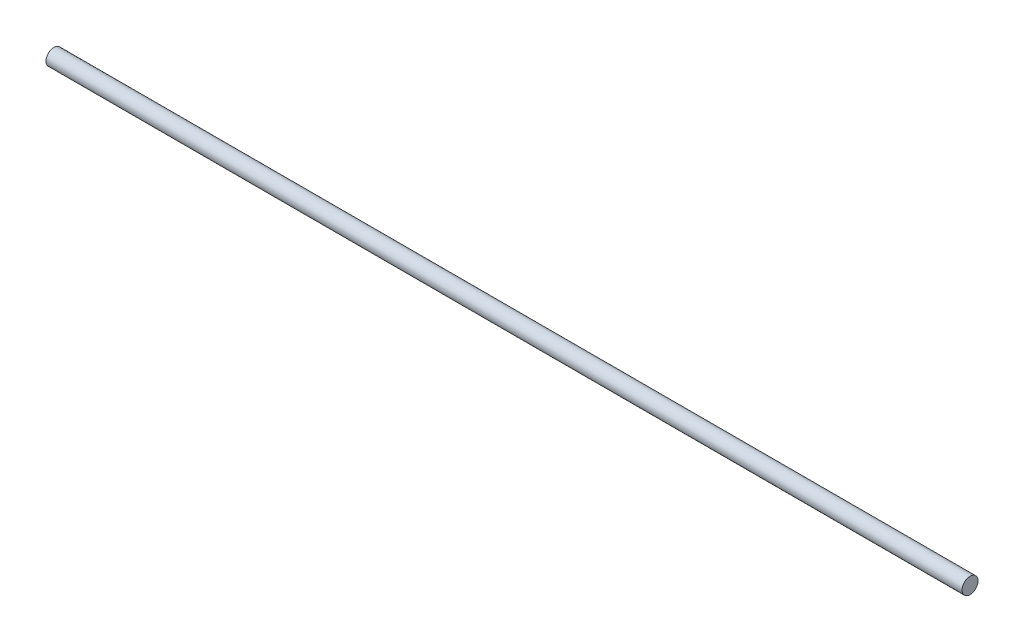
ISO-10303-21;
HEADER;
FILE_DESCRIPTION(('STEP AP214'),'2;1');
FILE_NAME('part.step','',(''),(''),'','','');
FILE_SCHEMA(('AUTOMOTIVE_DESIGN { 1 0 10303 214 1 1 1 1 }'));
ENDSEC;
DATA;
#1=APPLICATION_CONTEXT('core data for automotive mechanical design processes');
#2=APPLICATION_PROTOCOL_DEFINITION('international standard','automotive_design',2000,#1);
#3=PRODUCT_CONTEXT('',#1,'mechanical');
#4=PRODUCT('Part','Part','',(#3));
#5=PRODUCT_RELATED_PRODUCT_CATEGORY('part','',(#4));
#6=PRODUCT_DEFINITION_FORMATION('','',#4);
#7=PRODUCT_DEFINITION_CONTEXT('part definition',#1,'design');
#8=PRODUCT_DEFINITION('design','',#6,#7);
#9=PRODUCT_DEFINITION_SHAPE('','',#8);
#10=(LENGTH_UNIT() NAMED_UNIT(*) SI_UNIT(.MILLI.,.METRE.));
#11=(NAMED_UNIT(*) PLANE_ANGLE_UNIT() SI_UNIT($,.RADIAN.));
#12=(NAMED_UNIT(*) SI_UNIT($,.STERADIAN.) SOLID_ANGLE_UNIT());
#13=UNCERTAINTY_MEASURE_WITH_UNIT(LENGTH_MEASURE(1.E-05),#10,'distance_accuracy_value','');
#14=(GEOMETRIC_REPRESENTATION_CONTEXT(3) GLOBAL_UNCERTAINTY_ASSIGNED_CONTEXT((#13)) GLOBAL_UNIT_ASSIGNED_CONTEXT((#10,
#11,#12)) REPRESENTATION_CONTEXT('',''));
#15=CARTESIAN_POINT('',(0.,0.,0.));
#16=DIRECTION('',(0.,0.,1.));
#17=DIRECTION('',(1.,0.,0.));
#18=AXIS2_PLACEMENT_3D('',#15,#16,#17);
#19=CARTESIAN_POINT('',(460.,0.,0.));
#20=DIRECTION('',(-1.,0.,0.));
#21=DIRECTION('',(0.,0.,1.));
#22=AXIS2_PLACEMENT_3D('',#19,#20,#21);
#23=CYLINDRICAL_SURFACE('',#22,4.);
#24=CARTESIAN_POINT('',(460.,0.,0.));
#25=DIRECTION('',(1.,0.,0.));
#26=DIRECTION('',(0.,0.,-1.));
#27=AXIS2_PLACEMENT_3D('',#24,#25,#26);
#28=CIRCLE('',#27,4.);
#29=CARTESIAN_POINT('',(460.,0.,-4.));
#30=VERTEX_POINT('',#29);
#31=EDGE_CURVE('E10',#30,#30,#28,.T.);
#32=ORIENTED_EDGE('',*,*,#31,.F.);
#33=EDGE_LOOP('',(#32));
#34=FACE_BOUND('',#33,.T.);
#35=CARTESIAN_POINT('',(0.,0.,0.));
#36=DIRECTION('',(1.,0.,0.));
#37=DIRECTION('',(0.,0.,-1.));
#38=AXIS2_PLACEMENT_3D('',#35,#36,#37);
#39=CIRCLE('',#38,4.);
#40=CARTESIAN_POINT('',(0.,0.,-4.));
#41=VERTEX_POINT('',#40);
#42=EDGE_CURVE('E40',#41,#41,#39,.T.);
#43=ORIENTED_EDGE('',*,*,#42,.T.);
#44=EDGE_LOOP('',(#43));
#45=FACE_BOUND('',#44,.T.);
#46=ADVANCED_FACE('F37',(#34,#45),#23,.T.);
#47=CARTESIAN_POINT('',(460.,0.,0.));
#48=DIRECTION('',(1.,0.,0.));
#49=DIRECTION('',(0.,0.,-1.));
#50=AXIS2_PLACEMENT_3D('',#47,#48,#49);
#51=PLANE('',#50);
#52=ORIENTED_EDGE('',*,*,#31,.T.);
#53=EDGE_LOOP('',(#52));
#54=FACE_BOUND('',#53,.T.);
#55=ADVANCED_FACE('F52',(#54),#51,.T.);
#56=CARTESIAN_POINT('',(0.,0.,0.));
#57=DIRECTION('',(1.,0.,0.));
#58=DIRECTION('',(0.,0.,-1.));
#59=AXIS2_PLACEMENT_3D('',#56,#57,#58);
#60=PLANE('',#59);
#61=ORIENTED_EDGE('',*,*,#42,.F.);
#62=EDGE_LOOP('',(#61));
#63=FACE_BOUND('',#62,.T.);
#64=ADVANCED_FACE('F50',(#63),#60,.F.);
#65=CLOSED_SHELL('',(#46,#55,#64));
#66=MANIFOLD_SOLID_BREP('B2',#65);
#67=ADVANCED_BREP_SHAPE_REPRESENTATION('',(#18,#66),#14);
#68=SHAPE_DEFINITION_REPRESENTATION(#9,#67);
ENDSEC;
END-ISO-10303-21;
